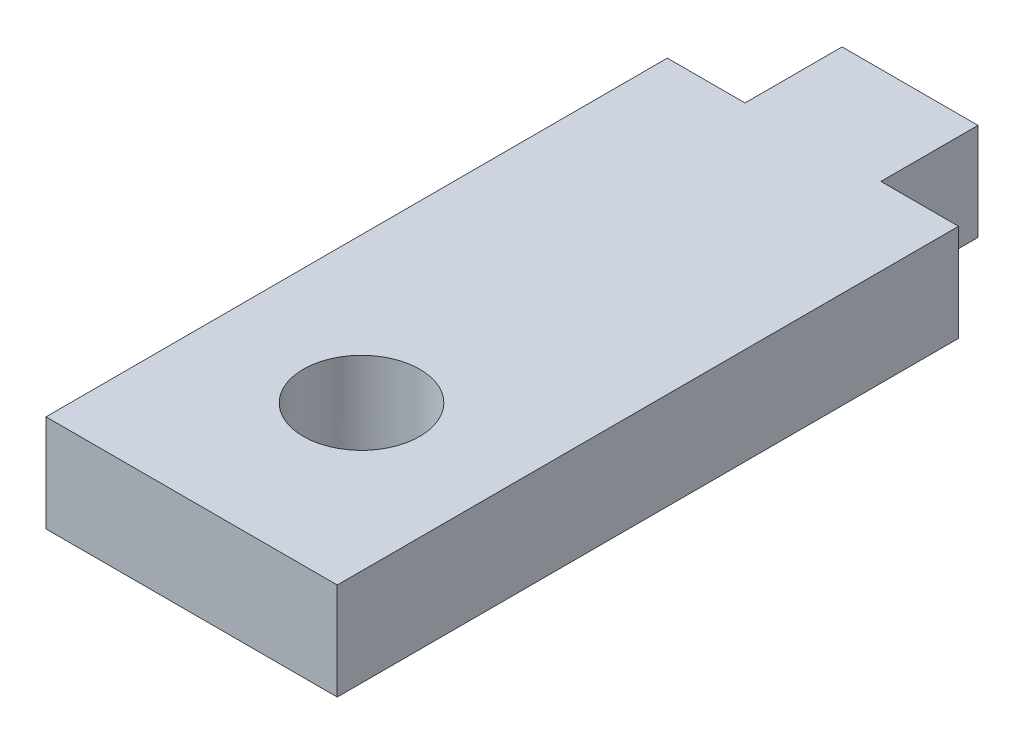
ISO-10303-21;
HEADER;
FILE_DESCRIPTION(('STEP AP214'),'2;1');
FILE_NAME('part.step','',(''),(''),'','','');
FILE_SCHEMA(('AUTOMOTIVE_DESIGN { 1 0 10303 214 1 1 1 1 }'));
ENDSEC;
DATA;
#1=APPLICATION_CONTEXT('core data for automotive mechanical design processes');
#2=APPLICATION_PROTOCOL_DEFINITION('international standard','automotive_design',2000,#1);
#3=PRODUCT_CONTEXT('',#1,'mechanical');
#4=PRODUCT('Part','Part','',(#3));
#5=PRODUCT_RELATED_PRODUCT_CATEGORY('part','',(#4));
#6=PRODUCT_DEFINITION_FORMATION('','',#4);
#7=PRODUCT_DEFINITION_CONTEXT('part definition',#1,'design');
#8=PRODUCT_DEFINITION('design','',#6,#7);
#9=PRODUCT_DEFINITION_SHAPE('','',#8);
#10=(LENGTH_UNIT() NAMED_UNIT(*) SI_UNIT(.MILLI.,.METRE.));
#11=(NAMED_UNIT(*) PLANE_ANGLE_UNIT() SI_UNIT($,.RADIAN.));
#12=(NAMED_UNIT(*) SI_UNIT($,.STERADIAN.) SOLID_ANGLE_UNIT());
#13=UNCERTAINTY_MEASURE_WITH_UNIT(LENGTH_MEASURE(1.E-05),#10,'distance_accuracy_value','');
#14=(GEOMETRIC_REPRESENTATION_CONTEXT(3) GLOBAL_UNCERTAINTY_ASSIGNED_CONTEXT((#13)) GLOBAL_UNIT_ASSIGNED_CONTEXT((#10,
#11,#12)) REPRESENTATION_CONTEXT('',''));
#15=CARTESIAN_POINT('',(0.,0.,0.));
#16=DIRECTION('',(0.,0.,1.));
#17=DIRECTION('',(1.,0.,0.));
#18=AXIS2_PLACEMENT_3D('',#15,#16,#17);
#19=CARTESIAN_POINT('',(7.49999999999999,5.,16.));
#20=DIRECTION('',(0.,0.,-1.));
#21=DIRECTION('',(-1.,0.,0.));
#22=AXIS2_PLACEMENT_3D('',#19,#20,#21);
#23=PLANE('',#22);
#24=DIRECTION('',(1.,0.,0.));
#25=VECTOR('',#24,1.);
#26=CARTESIAN_POINT('',(7.49999999999999,0.,16.));
#27=LINE('',#26,#25);
#28=CARTESIAN_POINT('',(-7.5,0.,16.));
#29=VERTEX_POINT('',#28);
#30=CARTESIAN_POINT('',(7.49999999999999,0.,16.));
#31=VERTEX_POINT('',#30);
#32=EDGE_CURVE('E138',#29,#31,#27,.T.);
#33=ORIENTED_EDGE('',*,*,#32,.T.);
#34=DIRECTION('',(0.,-1.,0.));
#35=VECTOR('',#34,1.);
#36=CARTESIAN_POINT('',(7.49999999999999,5.,16.));
#37=LINE('',#36,#35);
#38=CARTESIAN_POINT('',(7.49999999999999,5.,16.));
#39=VERTEX_POINT('',#38);
#40=EDGE_CURVE('E11',#39,#31,#37,.T.);
#41=ORIENTED_EDGE('',*,*,#40,.F.);
#42=DIRECTION('',(1.,0.,0.));
#43=VECTOR('',#42,1.);
#44=CARTESIAN_POINT('',(7.49999999999999,5.,16.));
#45=LINE('',#44,#43);
#46=CARTESIAN_POINT('',(-7.5,5.,16.));
#47=VERTEX_POINT('',#46);
#48=EDGE_CURVE('E152',#47,#39,#45,.T.);
#49=ORIENTED_EDGE('',*,*,#48,.F.);
#50=DIRECTION('',(0.,-1.,0.));
#51=VECTOR('',#50,1.);
#52=CARTESIAN_POINT('',(-7.5,5.,16.));
#53=LINE('',#52,#51);
#54=EDGE_CURVE('E134',#47,#29,#53,.T.);
#55=ORIENTED_EDGE('',*,*,#54,.T.);
#56=EDGE_LOOP('',(#33,#41,#49,#55));
#57=FACE_BOUND('',#56,.T.);
#58=ADVANCED_FACE('F41',(#57),#23,.F.);
#59=CARTESIAN_POINT('',(7.50000000000001,5.00000000000004,-16.));
#60=DIRECTION('',(-1.,0.,0.));
#61=DIRECTION('',(0.,0.,1.));
#62=AXIS2_PLACEMENT_3D('',#59,#60,#61);
#63=PLANE('',#62);
#64=DIRECTION('',(0.,0.,-1.));
#65=VECTOR('',#64,1.);
#66=CARTESIAN_POINT('',(7.50000000000001,0.,-16.));
#67=LINE('',#66,#65);
#68=CARTESIAN_POINT('',(7.50000000000001,0.,-16.));
#69=VERTEX_POINT('',#68);
#70=EDGE_CURVE('E141',#31,#69,#67,.T.);
#71=ORIENTED_EDGE('',*,*,#70,.T.);
#72=DIRECTION('',(0.,-1.,0.));
#73=VECTOR('',#72,1.);
#74=CARTESIAN_POINT('',(7.50000000000001,5.00000000000004,-16.));
#75=LINE('',#74,#73);
#76=CARTESIAN_POINT('',(7.50000000000001,5.00000000000004,-16.));
#77=VERTEX_POINT('',#76);
#78=EDGE_CURVE('E50',#77,#69,#75,.T.);
#79=ORIENTED_EDGE('',*,*,#78,.F.);
#80=DIRECTION('',(0.,0.,-1.));
#81=VECTOR('',#80,1.);
#82=CARTESIAN_POINT('',(7.50000000000001,5.00000000000004,-16.));
#83=LINE('',#82,#81);
#84=EDGE_CURVE('E101',#39,#77,#83,.T.);
#85=ORIENTED_EDGE('',*,*,#84,.F.);
#86=ORIENTED_EDGE('',*,*,#40,.T.);
#87=EDGE_LOOP('',(#71,#79,#85,#86));
#88=FACE_BOUND('',#87,.T.);
#89=ADVANCED_FACE('F207',(#88),#63,.F.);
#90=CARTESIAN_POINT('',(3.5,5.00000000000004,-16.));
#91=DIRECTION('',(0.,0.,1.));
#92=DIRECTION('',(1.,0.,0.));
#93=AXIS2_PLACEMENT_3D('',#90,#91,#92);
#94=PLANE('',#93);
#95=DIRECTION('',(-1.,0.,0.));
#96=VECTOR('',#95,1.);
#97=CARTESIAN_POINT('',(3.5,0.,-16.));
#98=LINE('',#97,#96);
#99=CARTESIAN_POINT('',(3.5,0.,-16.));
#100=VERTEX_POINT('',#99);
#101=EDGE_CURVE('E143',#69,#100,#98,.T.);
#102=ORIENTED_EDGE('',*,*,#101,.T.);
#103=DIRECTION('',(0.,-1.,0.));
#104=VECTOR('',#103,1.);
#105=CARTESIAN_POINT('',(3.5,5.00000000000004,-16.));
#106=LINE('',#105,#104);
#107=CARTESIAN_POINT('',(3.5,5.00000000000004,-16.));
#108=VERTEX_POINT('',#107);
#109=EDGE_CURVE('E159',#108,#100,#106,.T.);
#110=ORIENTED_EDGE('',*,*,#109,.F.);
#111=DIRECTION('',(-1.,0.,0.));
#112=VECTOR('',#111,1.);
#113=CARTESIAN_POINT('',(3.5,5.00000000000004,-16.));
#114=LINE('',#113,#112);
#115=EDGE_CURVE('E168',#77,#108,#114,.T.);
#116=ORIENTED_EDGE('',*,*,#115,.F.);
#117=ORIENTED_EDGE('',*,*,#78,.T.);
#118=EDGE_LOOP('',(#102,#110,#116,#117));
#119=FACE_BOUND('',#118,.T.);
#120=ADVANCED_FACE('F166',(#119),#94,.F.);
#121=CARTESIAN_POINT('',(3.49999999999993,5.00000000000004,-21.));
#122=DIRECTION('',(-1.,0.,0.));
#123=DIRECTION('',(0.,0.,1.));
#124=AXIS2_PLACEMENT_3D('',#121,#122,#123);
#125=PLANE('',#124);
#126=DIRECTION('',(0.,0.,-1.));
#127=VECTOR('',#126,1.);
#128=CARTESIAN_POINT('',(3.49999999999993,0.,-21.));
#129=LINE('',#128,#127);
#130=CARTESIAN_POINT('',(3.49999999999993,0.,-21.));
#131=VERTEX_POINT('',#130);
#132=EDGE_CURVE('E145',#100,#131,#129,.T.);
#133=ORIENTED_EDGE('',*,*,#132,.T.);
#134=DIRECTION('',(0.,-1.,0.));
#135=VECTOR('',#134,1.);
#136=CARTESIAN_POINT('',(3.49999999999993,5.00000000000004,-21.));
#137=LINE('',#136,#135);
#138=CARTESIAN_POINT('',(3.49999999999993,5.00000000000004,-21.));
#139=VERTEX_POINT('',#138);
#140=EDGE_CURVE('E156',#139,#131,#137,.T.);
#141=ORIENTED_EDGE('',*,*,#140,.F.);
#142=DIRECTION('',(0.,0.,-1.));
#143=VECTOR('',#142,1.);
#144=CARTESIAN_POINT('',(3.49999999999993,5.00000000000004,-21.));
#145=LINE('',#144,#143);
#146=EDGE_CURVE('E180',#108,#139,#145,.T.);
#147=ORIENTED_EDGE('',*,*,#146,.F.);
#148=ORIENTED_EDGE('',*,*,#109,.T.);
#149=EDGE_LOOP('',(#133,#141,#147,#148));
#150=FACE_BOUND('',#149,.T.);
#151=ADVANCED_FACE('F176',(#150),#125,.F.);
#152=CARTESIAN_POINT('',(-3.50000000000007,5.00000000000004,-21.));
#153=DIRECTION('',(0.,0.,1.));
#154=DIRECTION('',(1.,0.,0.));
#155=AXIS2_PLACEMENT_3D('',#152,#153,#154);
#156=PLANE('',#155);
#157=DIRECTION('',(-1.,0.,0.));
#158=VECTOR('',#157,1.);
#159=CARTESIAN_POINT('',(-3.50000000000007,0.,-21.));
#160=LINE('',#159,#158);
#161=CARTESIAN_POINT('',(-3.50000000000007,0.,-21.));
#162=VERTEX_POINT('',#161);
#163=EDGE_CURVE('E147',#131,#162,#160,.T.);
#164=ORIENTED_EDGE('',*,*,#163,.T.);
#165=DIRECTION('',(0.,-1.,0.));
#166=VECTOR('',#165,1.);
#167=CARTESIAN_POINT('',(-3.50000000000007,5.00000000000004,-21.));
#168=LINE('',#167,#166);
#169=CARTESIAN_POINT('',(-3.50000000000007,5.00000000000004,-21.));
#170=VERTEX_POINT('',#169);
#171=EDGE_CURVE('E129',#170,#162,#168,.T.);
#172=ORIENTED_EDGE('',*,*,#171,.F.);
#173=DIRECTION('',(-1.,0.,0.));
#174=VECTOR('',#173,1.);
#175=CARTESIAN_POINT('',(-3.50000000000007,5.00000000000004,-21.));
#176=LINE('',#175,#174);
#177=EDGE_CURVE('E120',#139,#170,#176,.T.);
#178=ORIENTED_EDGE('',*,*,#177,.F.);
#179=ORIENTED_EDGE('',*,*,#140,.T.);
#180=EDGE_LOOP('',(#164,#172,#178,#179));
#181=FACE_BOUND('',#180,.T.);
#182=ADVANCED_FACE('F179',(#181),#156,.F.);
#183=CARTESIAN_POINT('',(-3.5,5.00000000000004,-16.));
#184=DIRECTION('',(1.,0.,0.));
#185=DIRECTION('',(0.,0.,-1.));
#186=AXIS2_PLACEMENT_3D('',#183,#184,#185);
#187=PLANE('',#186);
#188=DIRECTION('',(0.,0.,1.));
#189=VECTOR('',#188,1.);
#190=CARTESIAN_POINT('',(-3.5,0.,-16.));
#191=LINE('',#190,#189);
#192=CARTESIAN_POINT('',(-3.5,0.,-16.));
#193=VERTEX_POINT('',#192);
#194=EDGE_CURVE('E128',#162,#193,#191,.T.);
#195=ORIENTED_EDGE('',*,*,#194,.T.);
#196=DIRECTION('',(0.,-1.,0.));
#197=VECTOR('',#196,1.);
#198=CARTESIAN_POINT('',(-3.5,5.00000000000004,-16.));
#199=LINE('',#198,#197);
#200=CARTESIAN_POINT('',(-3.5,5.00000000000004,-16.));
#201=VERTEX_POINT('',#200);
#202=EDGE_CURVE('E125',#201,#193,#199,.T.);
#203=ORIENTED_EDGE('',*,*,#202,.F.);
#204=DIRECTION('',(0.,0.,1.));
#205=VECTOR('',#204,1.);
#206=CARTESIAN_POINT('',(-3.5,5.00000000000004,-16.));
#207=LINE('',#206,#205);
#208=EDGE_CURVE('E114',#170,#201,#207,.T.);
#209=ORIENTED_EDGE('',*,*,#208,.F.);
#210=ORIENTED_EDGE('',*,*,#171,.T.);
#211=EDGE_LOOP('',(#195,#203,#209,#210));
#212=FACE_BOUND('',#211,.T.);
#213=ADVANCED_FACE('F126',(#212),#187,.F.);
#214=CARTESIAN_POINT('',(-7.5,5.00000000000004,-16.));
#215=DIRECTION('',(0.,0.,1.));
#216=DIRECTION('',(1.,0.,0.));
#217=AXIS2_PLACEMENT_3D('',#214,#215,#216);
#218=PLANE('',#217);
#219=DIRECTION('',(-1.,0.,0.));
#220=VECTOR('',#219,1.);
#221=CARTESIAN_POINT('',(-7.5,0.,-16.));
#222=LINE('',#221,#220);
#223=CARTESIAN_POINT('',(-7.5,0.,-16.));
#224=VERTEX_POINT('',#223);
#225=EDGE_CURVE('E87',#193,#224,#222,.T.);
#226=ORIENTED_EDGE('',*,*,#225,.T.);
#227=DIRECTION('',(0.,-1.,0.));
#228=VECTOR('',#227,1.);
#229=CARTESIAN_POINT('',(-7.5,5.00000000000004,-16.));
#230=LINE('',#229,#228);
#231=CARTESIAN_POINT('',(-7.5,5.00000000000004,-16.));
#232=VERTEX_POINT('',#231);
#233=EDGE_CURVE('E130',#232,#224,#230,.T.);
#234=ORIENTED_EDGE('',*,*,#233,.F.);
#235=DIRECTION('',(-1.,0.,0.));
#236=VECTOR('',#235,1.);
#237=CARTESIAN_POINT('',(-7.5,5.00000000000004,-16.));
#238=LINE('',#237,#236);
#239=EDGE_CURVE('E118',#201,#232,#238,.T.);
#240=ORIENTED_EDGE('',*,*,#239,.F.);
#241=ORIENTED_EDGE('',*,*,#202,.T.);
#242=EDGE_LOOP('',(#226,#234,#240,#241));
#243=FACE_BOUND('',#242,.T.);
#244=ADVANCED_FACE('F132',(#243),#218,.F.);
#245=CARTESIAN_POINT('',(-7.5,5.,16.));
#246=DIRECTION('',(1.,0.,0.));
#247=DIRECTION('',(0.,0.,-1.));
#248=AXIS2_PLACEMENT_3D('',#245,#246,#247);
#249=PLANE('',#248);
#250=DIRECTION('',(0.,0.,1.));
#251=VECTOR('',#250,1.);
#252=CARTESIAN_POINT('',(-7.5,0.,16.));
#253=LINE('',#252,#251);
#254=EDGE_CURVE('E93',#224,#29,#253,.T.);
#255=ORIENTED_EDGE('',*,*,#254,.T.);
#256=ORIENTED_EDGE('',*,*,#54,.F.);
#257=DIRECTION('',(0.,0.,1.));
#258=VECTOR('',#257,1.);
#259=CARTESIAN_POINT('',(-7.5,5.,16.));
#260=LINE('',#259,#258);
#261=EDGE_CURVE('E58',#232,#47,#260,.T.);
#262=ORIENTED_EDGE('',*,*,#261,.F.);
#263=ORIENTED_EDGE('',*,*,#233,.T.);
#264=EDGE_LOOP('',(#255,#256,#262,#263));
#265=FACE_BOUND('',#264,.T.);
#266=ADVANCED_FACE('F202',(#265),#249,.F.);
#267=CARTESIAN_POINT('',(0.,5.,0.));
#268=DIRECTION('',(0.,-1.,0.));
#269=DIRECTION('',(0.,0.,-1.));
#270=AXIS2_PLACEMENT_3D('',#267,#268,#269);
#271=PLANE('',#270);
#272=CARTESIAN_POINT('',(0.,5.,7.25000000000001));
#273=DIRECTION('',(0.,1.,0.));
#274=DIRECTION('',(0.,0.,1.));
#275=AXIS2_PLACEMENT_3D('',#272,#273,#274);
#276=CIRCLE('',#275,3.);
#277=CARTESIAN_POINT('',(0.,5.,10.25));
#278=VERTEX_POINT('',#277);
#279=EDGE_CURVE('E186',#278,#278,#276,.T.);
#280=ORIENTED_EDGE('',*,*,#279,.F.);
#281=EDGE_LOOP('',(#280));
#282=FACE_BOUND('',#281,.T.);
#283=ORIENTED_EDGE('',*,*,#48,.T.);
#284=ORIENTED_EDGE('',*,*,#84,.T.);
#285=ORIENTED_EDGE('',*,*,#115,.T.);
#286=ORIENTED_EDGE('',*,*,#146,.T.);
#287=ORIENTED_EDGE('',*,*,#177,.T.);
#288=ORIENTED_EDGE('',*,*,#208,.T.);
#289=ORIENTED_EDGE('',*,*,#239,.T.);
#290=ORIENTED_EDGE('',*,*,#261,.T.);
#291=EDGE_LOOP('',(#283,#284,#285,#286,#287,#288,#289,#290));
#292=FACE_BOUND('',#291,.T.);
#293=ADVANCED_FACE('F116',(#282,#292),#271,.F.);
#294=CARTESIAN_POINT('',(0.,0.,0.));
#295=DIRECTION('',(0.,-1.,0.));
#296=DIRECTION('',(0.,0.,-1.));
#297=AXIS2_PLACEMENT_3D('',#294,#295,#296);
#298=PLANE('',#297);
#299=CARTESIAN_POINT('',(0.,0.,7.25000000000001));
#300=DIRECTION('',(0.,-1.,0.));
#301=DIRECTION('',(0.,0.,-1.));
#302=AXIS2_PLACEMENT_3D('',#299,#300,#301);
#303=CIRCLE('',#302,3.);
#304=CARTESIAN_POINT('',(0.,0.,4.25000000000001));
#305=VERTEX_POINT('',#304);
#306=EDGE_CURVE('E44',#305,#305,#303,.T.);
#307=ORIENTED_EDGE('',*,*,#306,.F.);
#308=EDGE_LOOP('',(#307));
#309=FACE_BOUND('',#308,.T.);
#310=ORIENTED_EDGE('',*,*,#32,.F.);
#311=ORIENTED_EDGE('',*,*,#254,.F.);
#312=ORIENTED_EDGE('',*,*,#225,.F.);
#313=ORIENTED_EDGE('',*,*,#194,.F.);
#314=ORIENTED_EDGE('',*,*,#163,.F.);
#315=ORIENTED_EDGE('',*,*,#132,.F.);
#316=ORIENTED_EDGE('',*,*,#101,.F.);
#317=ORIENTED_EDGE('',*,*,#70,.F.);
#318=EDGE_LOOP('',(#310,#311,#312,#313,#314,#315,#316,#317));
#319=FACE_BOUND('',#318,.T.);
#320=ADVANCED_FACE('F172',(#309,#319),#298,.T.);
#321=CARTESIAN_POINT('',(0.,-4.99999999999998,7.25000000000001));
#322=DIRECTION('',(0.,1.,0.));
#323=DIRECTION('',(0.,0.,1.));
#324=AXIS2_PLACEMENT_3D('',#321,#322,#323);
#325=CYLINDRICAL_SURFACE('',#324,3.);
#326=ORIENTED_EDGE('',*,*,#306,.T.);
#327=EDGE_LOOP('',(#326));
#328=FACE_BOUND('',#327,.T.);
#329=ORIENTED_EDGE('',*,*,#279,.T.);
#330=EDGE_LOOP('',(#329));
#331=FACE_BOUND('',#330,.T.);
#332=ADVANCED_FACE('F193',(#328,#331),#325,.F.);
#333=CLOSED_SHELL('',(#58,#89,#120,#151,#182,#213,#244,#266,#293,#320,#332));
#334=MANIFOLD_SOLID_BREP('B2',#333);
#335=ADVANCED_BREP_SHAPE_REPRESENTATION('',(#18,#334),#14);
#336=SHAPE_DEFINITION_REPRESENTATION(#9,#335);
ENDSEC;
END-ISO-10303-21;
